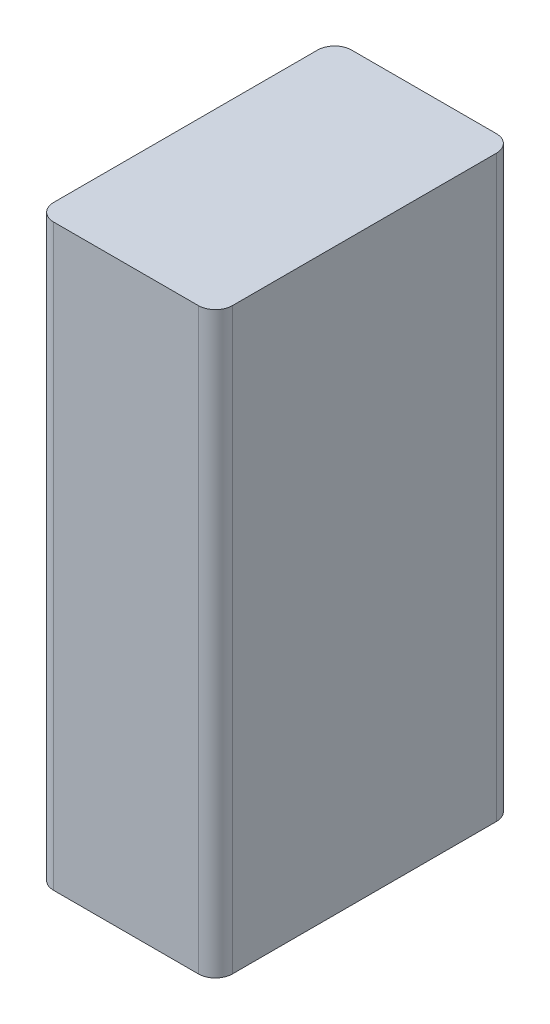
ISO-10303-21;
HEADER;
FILE_DESCRIPTION(('STEP AP214'),'2;1');
FILE_NAME('part.step','',(''),(''),'','','');
FILE_SCHEMA(('AUTOMOTIVE_DESIGN { 1 0 10303 214 1 1 1 1 }'));
ENDSEC;
DATA;
#1=APPLICATION_CONTEXT('core data for automotive mechanical design processes');
#2=APPLICATION_PROTOCOL_DEFINITION('international standard','automotive_design',2000,#1);
#3=PRODUCT_CONTEXT('',#1,'mechanical');
#4=PRODUCT('Part','Part','',(#3));
#5=PRODUCT_RELATED_PRODUCT_CATEGORY('part','',(#4));
#6=PRODUCT_DEFINITION_FORMATION('','',#4);
#7=PRODUCT_DEFINITION_CONTEXT('part definition',#1,'design');
#8=PRODUCT_DEFINITION('design','',#6,#7);
#9=PRODUCT_DEFINITION_SHAPE('','',#8);
#10=(LENGTH_UNIT() NAMED_UNIT(*) SI_UNIT(.MILLI.,.METRE.));
#11=(NAMED_UNIT(*) PLANE_ANGLE_UNIT() SI_UNIT($,.RADIAN.));
#12=(NAMED_UNIT(*) SI_UNIT($,.STERADIAN.) SOLID_ANGLE_UNIT());
#13=UNCERTAINTY_MEASURE_WITH_UNIT(LENGTH_MEASURE(1.E-05),#10,'distance_accuracy_value','');
#14=(GEOMETRIC_REPRESENTATION_CONTEXT(3) GLOBAL_UNCERTAINTY_ASSIGNED_CONTEXT((#13)) GLOBAL_UNIT_ASSIGNED_CONTEXT((#10,
#11,#12)) REPRESENTATION_CONTEXT('',''));
#15=CARTESIAN_POINT('',(0.,0.,0.));
#16=DIRECTION('',(0.,0.,1.));
#17=DIRECTION('',(1.,0.,0.));
#18=AXIS2_PLACEMENT_3D('',#15,#16,#17);
#19=CARTESIAN_POINT('',(0.,68.,0.));
#20=DIRECTION('',(1.,0.,0.));
#21=DIRECTION('',(0.,0.,-1.));
#22=AXIS2_PLACEMENT_3D('',#19,#20,#21);
#23=PLANE('',#22);
#24=DIRECTION('',(0.,0.,1.));
#25=VECTOR('',#24,1.);
#26=CARTESIAN_POINT('',(0.,68.,0.));
#27=LINE('',#26,#25);
#28=CARTESIAN_POINT('',(0.,68.,-33.));
#29=VERTEX_POINT('',#28);
#30=CARTESIAN_POINT('',(0.,68.,-2.));
#31=VERTEX_POINT('',#30);
#32=EDGE_CURVE('E127',#29,#31,#27,.T.);
#33=ORIENTED_EDGE('',*,*,#32,.F.);
#34=DIRECTION('',(0.,-1.,0.));
#35=VECTOR('',#34,1.);
#36=CARTESIAN_POINT('',(0.,68.,-33.));
#37=LINE('',#36,#35);
#38=CARTESIAN_POINT('',(0.,0.,-33.));
#39=VERTEX_POINT('',#38);
#40=EDGE_CURVE('E111',#29,#39,#37,.T.);
#41=ORIENTED_EDGE('',*,*,#40,.T.);
#42=DIRECTION('',(0.,0.,1.));
#43=VECTOR('',#42,1.);
#44=CARTESIAN_POINT('',(0.,0.,0.));
#45=LINE('',#44,#43);
#46=CARTESIAN_POINT('',(0.,0.,-2.));
#47=VERTEX_POINT('',#46);
#48=EDGE_CURVE('E124',#39,#47,#45,.T.);
#49=ORIENTED_EDGE('',*,*,#48,.T.);
#50=DIRECTION('',(0.,-1.,0.));
#51=VECTOR('',#50,1.);
#52=CARTESIAN_POINT('',(0.,68.,-2.));
#53=LINE('',#52,#51);
#54=EDGE_CURVE('E130',#47,#31,#53,.F.);
#55=ORIENTED_EDGE('',*,*,#54,.T.);
#56=EDGE_LOOP('',(#33,#41,#49,#55));
#57=FACE_BOUND('',#56,.T.);
#58=ADVANCED_FACE('F39',(#57),#23,.F.);
#59=CARTESIAN_POINT('',(0.,68.,0.));
#60=DIRECTION('',(0.,0.,-1.));
#61=DIRECTION('',(-1.,0.,0.));
#62=AXIS2_PLACEMENT_3D('',#59,#60,#61);
#63=PLANE('',#62);
#64=DIRECTION('',(1.,0.,0.));
#65=VECTOR('',#64,1.);
#66=CARTESIAN_POINT('',(0.,68.,0.));
#67=LINE('',#66,#65);
#68=CARTESIAN_POINT('',(2.,68.,0.));
#69=VERTEX_POINT('',#68);
#70=CARTESIAN_POINT('',(19.,68.,0.));
#71=VERTEX_POINT('',#70);
#72=EDGE_CURVE('E185',#69,#71,#67,.T.);
#73=ORIENTED_EDGE('',*,*,#72,.F.);
#74=DIRECTION('',(0.,-1.,0.));
#75=VECTOR('',#74,1.);
#76=CARTESIAN_POINT('',(2.,68.,0.));
#77=LINE('',#76,#75);
#78=CARTESIAN_POINT('',(2.,0.,0.));
#79=VERTEX_POINT('',#78);
#80=EDGE_CURVE('E11',#69,#79,#77,.T.);
#81=ORIENTED_EDGE('',*,*,#80,.T.);
#82=DIRECTION('',(1.,0.,0.));
#83=VECTOR('',#82,1.);
#84=CARTESIAN_POINT('',(0.,0.,0.));
#85=LINE('',#84,#83);
#86=CARTESIAN_POINT('',(19.,0.,0.));
#87=VERTEX_POINT('',#86);
#88=EDGE_CURVE('E136',#79,#87,#85,.T.);
#89=ORIENTED_EDGE('',*,*,#88,.T.);
#90=DIRECTION('',(0.,-1.,0.));
#91=VECTOR('',#90,1.);
#92=CARTESIAN_POINT('',(19.,68.,0.));
#93=LINE('',#92,#91);
#94=EDGE_CURVE('E48',#87,#71,#93,.F.);
#95=ORIENTED_EDGE('',*,*,#94,.T.);
#96=EDGE_LOOP('',(#73,#81,#89,#95));
#97=FACE_BOUND('',#96,.T.);
#98=ADVANCED_FACE('F184',(#97),#63,.F.);
#99=CARTESIAN_POINT('',(21.,68.,0.));
#100=DIRECTION('',(-1.,0.,0.));
#101=DIRECTION('',(0.,0.,1.));
#102=AXIS2_PLACEMENT_3D('',#99,#100,#101);
#103=PLANE('',#102);
#104=DIRECTION('',(0.,0.,-1.));
#105=VECTOR('',#104,1.);
#106=CARTESIAN_POINT('',(21.,0.,0.));
#107=LINE('',#106,#105);
#108=CARTESIAN_POINT('',(21.,0.,-2.));
#109=VERTEX_POINT('',#108);
#110=CARTESIAN_POINT('',(21.,0.,-33.));
#111=VERTEX_POINT('',#110);
#112=EDGE_CURVE('E140',#109,#111,#107,.T.);
#113=ORIENTED_EDGE('',*,*,#112,.T.);
#114=DIRECTION('',(0.,-1.,0.));
#115=VECTOR('',#114,1.);
#116=CARTESIAN_POINT('',(21.,68.,-33.));
#117=LINE('',#116,#115);
#118=CARTESIAN_POINT('',(21.,68.,-33.));
#119=VERTEX_POINT('',#118);
#120=EDGE_CURVE('E55',#111,#119,#117,.F.);
#121=ORIENTED_EDGE('',*,*,#120,.T.);
#122=DIRECTION('',(0.,0.,-1.));
#123=VECTOR('',#122,1.);
#124=CARTESIAN_POINT('',(21.,68.,0.));
#125=LINE('',#124,#123);
#126=CARTESIAN_POINT('',(21.,68.,-2.));
#127=VERTEX_POINT('',#126);
#128=EDGE_CURVE('E192',#127,#119,#125,.T.);
#129=ORIENTED_EDGE('',*,*,#128,.F.);
#130=DIRECTION('',(0.,-1.,0.));
#131=VECTOR('',#130,1.);
#132=CARTESIAN_POINT('',(21.,68.,-2.));
#133=LINE('',#132,#131);
#134=EDGE_CURVE('E175',#127,#109,#133,.T.);
#135=ORIENTED_EDGE('',*,*,#134,.T.);
#136=EDGE_LOOP('',(#113,#121,#129,#135));
#137=FACE_BOUND('',#136,.T.);
#138=ADVANCED_FACE('F196',(#137),#103,.F.);
#139=CARTESIAN_POINT('',(0.,68.,-35.));
#140=DIRECTION('',(0.,0.,1.));
#141=DIRECTION('',(1.,0.,0.));
#142=AXIS2_PLACEMENT_3D('',#139,#140,#141);
#143=PLANE('',#142);
#144=DIRECTION('',(-1.,0.,0.));
#145=VECTOR('',#144,1.);
#146=CARTESIAN_POINT('',(0.,0.,-35.));
#147=LINE('',#146,#145);
#148=CARTESIAN_POINT('',(19.,0.,-35.));
#149=VERTEX_POINT('',#148);
#150=CARTESIAN_POINT('',(2.,0.,-35.));
#151=VERTEX_POINT('',#150);
#152=EDGE_CURVE('E148',#149,#151,#147,.T.);
#153=ORIENTED_EDGE('',*,*,#152,.T.);
#154=DIRECTION('',(0.,-1.,0.));
#155=VECTOR('',#154,1.);
#156=CARTESIAN_POINT('',(2.,68.,-35.));
#157=LINE('',#156,#155);
#158=CARTESIAN_POINT('',(2.,68.,-35.));
#159=VERTEX_POINT('',#158);
#160=EDGE_CURVE('E112',#151,#159,#157,.F.);
#161=ORIENTED_EDGE('',*,*,#160,.T.);
#162=DIRECTION('',(-1.,0.,0.));
#163=VECTOR('',#162,1.);
#164=CARTESIAN_POINT('',(0.,68.,-35.));
#165=LINE('',#164,#163);
#166=CARTESIAN_POINT('',(19.,68.,-35.));
#167=VERTEX_POINT('',#166);
#168=EDGE_CURVE('E143',#167,#159,#165,.T.);
#169=ORIENTED_EDGE('',*,*,#168,.F.);
#170=DIRECTION('',(0.,-1.,0.));
#171=VECTOR('',#170,1.);
#172=CARTESIAN_POINT('',(19.,68.,-35.));
#173=LINE('',#172,#171);
#174=EDGE_CURVE('E118',#167,#149,#173,.T.);
#175=ORIENTED_EDGE('',*,*,#174,.T.);
#176=EDGE_LOOP('',(#153,#161,#169,#175));
#177=FACE_BOUND('',#176,.T.);
#178=ADVANCED_FACE('F203',(#177),#143,.F.);
#179=CARTESIAN_POINT('',(0.,68.,0.));
#180=DIRECTION('',(0.,-1.,0.));
#181=DIRECTION('',(0.,0.,-1.));
#182=AXIS2_PLACEMENT_3D('',#179,#180,#181);
#183=PLANE('',#182);
#184=ORIENTED_EDGE('',*,*,#168,.T.);
#185=CARTESIAN_POINT('',(2.,68.,-33.));
#186=DIRECTION('',(0.,-1.,0.));
#187=DIRECTION('',(0.,0.,-1.));
#188=AXIS2_PLACEMENT_3D('',#185,#186,#187);
#189=CIRCLE('',#188,2.);
#190=EDGE_CURVE('E172',#159,#29,#189,.F.);
#191=ORIENTED_EDGE('',*,*,#190,.T.);
#192=ORIENTED_EDGE('',*,*,#32,.T.);
#193=CARTESIAN_POINT('',(2.,68.,-2.));
#194=DIRECTION('',(0.,-1.,0.));
#195=DIRECTION('',(0.,0.,-1.));
#196=AXIS2_PLACEMENT_3D('',#193,#194,#195);
#197=CIRCLE('',#196,2.);
#198=EDGE_CURVE('E166',#31,#69,#197,.F.);
#199=ORIENTED_EDGE('',*,*,#198,.T.);
#200=ORIENTED_EDGE('',*,*,#72,.T.);
#201=CARTESIAN_POINT('',(19.,68.,-2.));
#202=DIRECTION('',(0.,-1.,0.));
#203=DIRECTION('',(0.,0.,-1.));
#204=AXIS2_PLACEMENT_3D('',#201,#202,#203);
#205=CIRCLE('',#204,2.);
#206=EDGE_CURVE('E62',#71,#127,#205,.F.);
#207=ORIENTED_EDGE('',*,*,#206,.T.);
#208=ORIENTED_EDGE('',*,*,#128,.T.);
#209=CARTESIAN_POINT('',(19.,68.,-33.));
#210=DIRECTION('',(0.,-1.,0.));
#211=DIRECTION('',(0.,0.,-1.));
#212=AXIS2_PLACEMENT_3D('',#209,#210,#211);
#213=CIRCLE('',#212,2.);
#214=EDGE_CURVE('E169',#119,#167,#213,.F.);
#215=ORIENTED_EDGE('',*,*,#214,.T.);
#216=EDGE_LOOP('',(#184,#191,#192,#199,#200,#207,#208,#215));
#217=FACE_BOUND('',#216,.T.);
#218=ADVANCED_FACE('F189',(#217),#183,.F.);
#219=CARTESIAN_POINT('',(0.,0.,0.));
#220=DIRECTION('',(0.,-1.,0.));
#221=DIRECTION('',(0.,0.,-1.));
#222=AXIS2_PLACEMENT_3D('',#219,#220,#221);
#223=PLANE('',#222);
#224=ORIENTED_EDGE('',*,*,#48,.F.);
#225=CARTESIAN_POINT('',(2.,0.,-33.));
#226=DIRECTION('',(0.,-1.,0.));
#227=DIRECTION('',(0.,0.,-1.));
#228=AXIS2_PLACEMENT_3D('',#225,#226,#227);
#229=CIRCLE('',#228,2.);
#230=EDGE_CURVE('E107',#39,#151,#229,.T.);
#231=ORIENTED_EDGE('',*,*,#230,.T.);
#232=ORIENTED_EDGE('',*,*,#152,.F.);
#233=CARTESIAN_POINT('',(19.,0.,-33.));
#234=DIRECTION('',(0.,-1.,0.));
#235=DIRECTION('',(0.,0.,-1.));
#236=AXIS2_PLACEMENT_3D('',#233,#234,#235);
#237=CIRCLE('',#236,2.);
#238=EDGE_CURVE('E119',#149,#111,#237,.T.);
#239=ORIENTED_EDGE('',*,*,#238,.T.);
#240=ORIENTED_EDGE('',*,*,#112,.F.);
#241=CARTESIAN_POINT('',(19.,0.,-2.));
#242=DIRECTION('',(0.,-1.,0.));
#243=DIRECTION('',(0.,0.,-1.));
#244=AXIS2_PLACEMENT_3D('',#241,#242,#243);
#245=CIRCLE('',#244,2.);
#246=EDGE_CURVE('E129',#109,#87,#245,.T.);
#247=ORIENTED_EDGE('',*,*,#246,.T.);
#248=ORIENTED_EDGE('',*,*,#88,.F.);
#249=CARTESIAN_POINT('',(2.,0.,-2.));
#250=DIRECTION('',(0.,-1.,0.));
#251=DIRECTION('',(0.,0.,-1.));
#252=AXIS2_PLACEMENT_3D('',#249,#250,#251);
#253=CIRCLE('',#252,2.);
#254=EDGE_CURVE('E134',#79,#47,#253,.T.);
#255=ORIENTED_EDGE('',*,*,#254,.T.);
#256=EDGE_LOOP('',(#224,#231,#232,#239,#240,#247,#248,#255));
#257=FACE_BOUND('',#256,.T.);
#258=ADVANCED_FACE('F132',(#257),#223,.T.);
#259=CARTESIAN_POINT('',(2.,68.,-33.));
#260=DIRECTION('',(0.,-1.,0.));
#261=DIRECTION('',(0.,0.,-1.));
#262=AXIS2_PLACEMENT_3D('',#259,#260,#261);
#263=CYLINDRICAL_SURFACE('',#262,2.);
#264=ORIENTED_EDGE('',*,*,#190,.F.);
#265=ORIENTED_EDGE('',*,*,#160,.F.);
#266=ORIENTED_EDGE('',*,*,#230,.F.);
#267=ORIENTED_EDGE('',*,*,#40,.F.);
#268=EDGE_LOOP('',(#264,#265,#266,#267));
#269=FACE_BOUND('',#268,.T.);
#270=ADVANCED_FACE('F110',(#269),#263,.T.);
#271=CARTESIAN_POINT('',(19.,68.,-33.));
#272=DIRECTION('',(0.,-1.,0.));
#273=DIRECTION('',(0.,0.,-1.));
#274=AXIS2_PLACEMENT_3D('',#271,#272,#273);
#275=CYLINDRICAL_SURFACE('',#274,2.);
#276=ORIENTED_EDGE('',*,*,#214,.F.);
#277=ORIENTED_EDGE('',*,*,#120,.F.);
#278=ORIENTED_EDGE('',*,*,#238,.F.);
#279=ORIENTED_EDGE('',*,*,#174,.F.);
#280=EDGE_LOOP('',(#276,#277,#278,#279));
#281=FACE_BOUND('',#280,.T.);
#282=ADVANCED_FACE('F200',(#281),#275,.T.);
#283=CARTESIAN_POINT('',(2.,68.,-2.));
#284=DIRECTION('',(0.,-1.,0.));
#285=DIRECTION('',(0.,0.,-1.));
#286=AXIS2_PLACEMENT_3D('',#283,#284,#285);
#287=CYLINDRICAL_SURFACE('',#286,2.);
#288=ORIENTED_EDGE('',*,*,#198,.F.);
#289=ORIENTED_EDGE('',*,*,#54,.F.);
#290=ORIENTED_EDGE('',*,*,#254,.F.);
#291=ORIENTED_EDGE('',*,*,#80,.F.);
#292=EDGE_LOOP('',(#288,#289,#290,#291));
#293=FACE_BOUND('',#292,.T.);
#294=ADVANCED_FACE('F209',(#293),#287,.T.);
#295=CARTESIAN_POINT('',(19.,68.,-2.));
#296=DIRECTION('',(0.,-1.,0.));
#297=DIRECTION('',(0.,0.,-1.));
#298=AXIS2_PLACEMENT_3D('',#295,#296,#297);
#299=CYLINDRICAL_SURFACE('',#298,2.);
#300=ORIENTED_EDGE('',*,*,#206,.F.);
#301=ORIENTED_EDGE('',*,*,#94,.F.);
#302=ORIENTED_EDGE('',*,*,#246,.F.);
#303=ORIENTED_EDGE('',*,*,#134,.F.);
#304=EDGE_LOOP('',(#300,#301,#302,#303));
#305=FACE_BOUND('',#304,.T.);
#306=ADVANCED_FACE('F41',(#305),#299,.T.);
#307=CLOSED_SHELL('',(#58,#98,#138,#178,#218,#258,#270,#282,#294,#306));
#308=MANIFOLD_SOLID_BREP('B2',#307);
#309=ADVANCED_BREP_SHAPE_REPRESENTATION('',(#18,#308),#14);
#310=SHAPE_DEFINITION_REPRESENTATION(#9,#309);
ENDSEC;
END-ISO-10303-21;
